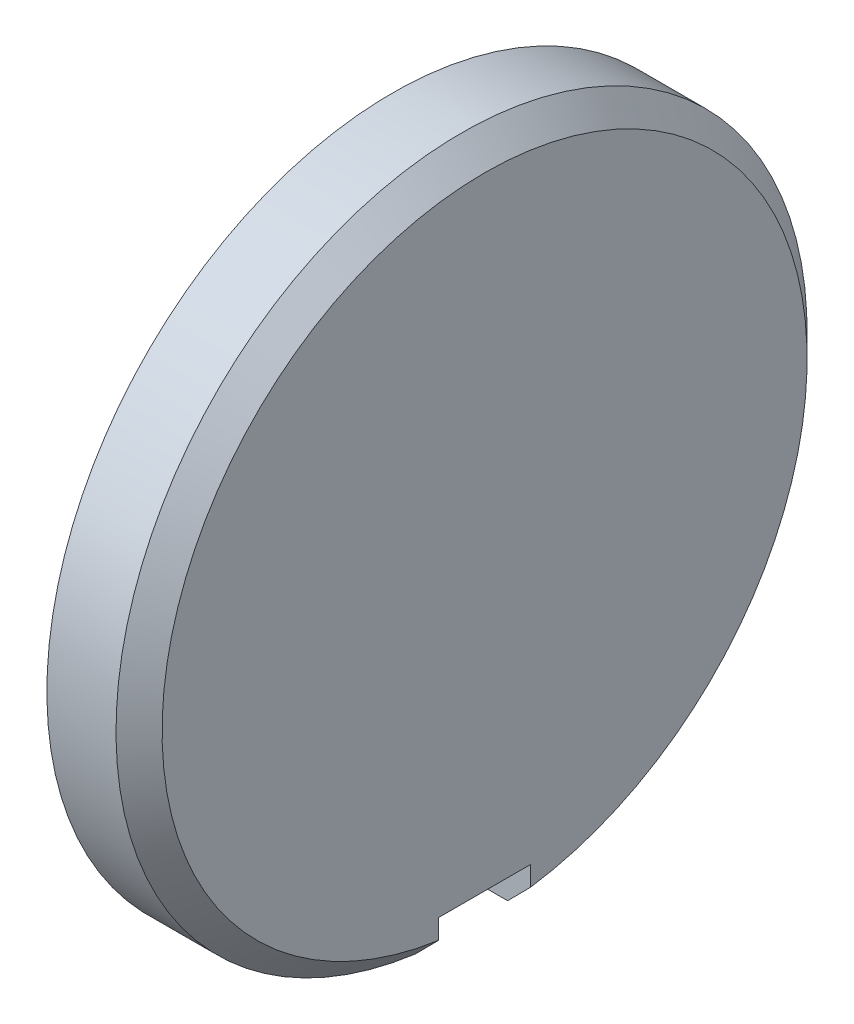
ISO-10303-21;
HEADER;
FILE_DESCRIPTION(('STEP AP214'),'2;1');
FILE_NAME('part.step','',(''),(''),'','','');
FILE_SCHEMA(('AUTOMOTIVE_DESIGN { 1 0 10303 214 1 1 1 1 }'));
ENDSEC;
DATA;
#1=APPLICATION_CONTEXT('core data for automotive mechanical design processes');
#2=APPLICATION_PROTOCOL_DEFINITION('international standard','automotive_design',2000,#1);
#3=PRODUCT_CONTEXT('',#1,'mechanical');
#4=PRODUCT('Part','Part','',(#3));
#5=PRODUCT_RELATED_PRODUCT_CATEGORY('part','',(#4));
#6=PRODUCT_DEFINITION_FORMATION('','',#4);
#7=PRODUCT_DEFINITION_CONTEXT('part definition',#1,'design');
#8=PRODUCT_DEFINITION('design','',#6,#7);
#9=PRODUCT_DEFINITION_SHAPE('','',#8);
#10=(LENGTH_UNIT() NAMED_UNIT(*) SI_UNIT(.MILLI.,.METRE.));
#11=(NAMED_UNIT(*) PLANE_ANGLE_UNIT() SI_UNIT($,.RADIAN.));
#12=(NAMED_UNIT(*) SI_UNIT($,.STERADIAN.) SOLID_ANGLE_UNIT());
#13=UNCERTAINTY_MEASURE_WITH_UNIT(LENGTH_MEASURE(1.E-05),#10,'distance_accuracy_value','');
#14=(GEOMETRIC_REPRESENTATION_CONTEXT(3) GLOBAL_UNCERTAINTY_ASSIGNED_CONTEXT((#13)) GLOBAL_UNIT_ASSIGNED_CONTEXT((#10,
#11,#12)) REPRESENTATION_CONTEXT('',''));
#15=CARTESIAN_POINT('',(0.,0.,0.));
#16=DIRECTION('',(0.,0.,1.));
#17=DIRECTION('',(1.,0.,0.));
#18=AXIS2_PLACEMENT_3D('',#15,#16,#17);
#19=CARTESIAN_POINT('',(76.8,-20.,-52.));
#20=DIRECTION('',(-1.,0.,0.));
#21=DIRECTION('',(0.,0.,1.));
#22=AXIS2_PLACEMENT_3D('',#19,#20,#21);
#23=PLANE('',#22);
#24=DIRECTION('',(0.,-1.,0.));
#25=VECTOR('',#24,1.);
#26=CARTESIAN_POINT('',(76.8,-20.,-51.2));
#27=LINE('',#26,#25);
#28=CARTESIAN_POINT('',(76.8,-25.2,-51.2));
#29=VERTEX_POINT('',#28);
#30=CARTESIAN_POINT('',(76.8,-25.5425625842204,-51.2));
#31=VERTEX_POINT('',#30);
#32=EDGE_CURVE('E210',#29,#31,#27,.T.);
#33=ORIENTED_EDGE('',*,*,#32,.F.);
#34=DIRECTION('',(0.,0.,1.));
#35=VECTOR('',#34,1.);
#36=CARTESIAN_POINT('',(76.8,-25.2,-52.));
#37=LINE('',#36,#35);
#38=CARTESIAN_POINT('',(76.8,-25.2,-52.8));
#39=VERTEX_POINT('',#38);
#40=EDGE_CURVE('E202',#39,#29,#37,.T.);
#41=ORIENTED_EDGE('',*,*,#40,.F.);
#42=DIRECTION('',(0.,-1.,0.));
#43=VECTOR('',#42,1.);
#44=CARTESIAN_POINT('',(76.8,-20.,-52.8));
#45=LINE('',#44,#43);
#46=CARTESIAN_POINT('',(76.8,-25.5425625842204,-52.8));
#47=VERTEX_POINT('',#46);
#48=EDGE_CURVE('E188',#39,#47,#45,.T.);
#49=ORIENTED_EDGE('',*,*,#48,.T.);
#50=CARTESIAN_POINT('',(76.8,-20.,-52.));
#51=DIRECTION('',(-1.,0.,0.));
#52=DIRECTION('',(0.,0.,1.));
#53=AXIS2_PLACEMENT_3D('',#50,#51,#52);
#54=CIRCLE('',#53,5.6);
#55=EDGE_CURVE('E315',#31,#47,#54,.T.);
#56=ORIENTED_EDGE('',*,*,#55,.F.);
#57=EDGE_LOOP('',(#33,#41,#49,#56));
#58=FACE_BOUND('',#57,.T.);
#59=ADVANCED_FACE('F47',(#58),#23,.F.);
#60=CARTESIAN_POINT('',(76.8,-20.,-52.));
#61=DIRECTION('',(-1.,0.,0.));
#62=DIRECTION('',(0.,0.,1.));
#63=AXIS2_PLACEMENT_3D('',#60,#61,#62);
#64=CONICAL_SURFACE('',#63,5.6,0.78539816339747);
#65=CARTESIAN_POINT('',(77.6946271909999,-24.6368667515551,-51.2));
#66=CARTESIAN_POINT('',(77.5126166868986,-24.8215553370668,-51.2));
#67=CARTESIAN_POINT('',(77.3304582431577,-25.0060979425621,-51.2));
#68=CARTESIAN_POINT('',(76.9659108831408,-25.374955064313,-51.2));
#69=CARTESIAN_POINT('',(76.7835219670777,-25.5592695807787,-51.2));
#70=CARTESIAN_POINT('',(76.418578818597,-25.9277346494659,-51.2));
#71=CARTESIAN_POINT('',(76.2360245862569,-26.1118852017641,-51.2));
#72=CARTESIAN_POINT('',(75.8707866928955,-26.480058250433,-51.2));
#73=CARTESIAN_POINT('',(75.6881030317566,-26.6640807466869,-51.2));
#74=CARTESIAN_POINT('',(75.5053728090001,-26.8480569582091,-51.2));
#75=B_SPLINE_CURVE_WITH_KNOTS('',3,(#65,#66,#67,#68,#69,#70,#71,#72,#73,#74),.UNSPECIFIED.,.F.,
.F.,(4,2,2,2,4),(0.,0.777906711944239,1.55581270618924,2.33371833583195,3.11162467374078),.UNSPECIFIED.);
#76=CARTESIAN_POINT('',(76.4,-25.9464274989274,-51.2));
#77=VERTEX_POINT('',#76);
#78=EDGE_CURVE('E217',#31,#77,#75,.T.);
#79=ORIENTED_EDGE('',*,*,#78,.F.);
#80=ORIENTED_EDGE('',*,*,#55,.T.);
#81=CARTESIAN_POINT('',(77.6946271909999,-24.6368667515551,-52.8));
#82=CARTESIAN_POINT('',(77.5126166868986,-24.8215553370668,-52.8));
#83=CARTESIAN_POINT('',(77.3304582431577,-25.0060979425621,-52.8));
#84=CARTESIAN_POINT('',(76.9659108831408,-25.374955064313,-52.8));
#85=CARTESIAN_POINT('',(76.7835219670777,-25.5592695807787,-52.8));
#86=CARTESIAN_POINT('',(76.418578818597,-25.9277346494659,-52.8));
#87=CARTESIAN_POINT('',(76.2360245862569,-26.1118852017641,-52.8));
#88=CARTESIAN_POINT('',(75.8707866928955,-26.480058250433,-52.8));
#89=CARTESIAN_POINT('',(75.6881030317566,-26.6640807466869,-52.8));
#90=CARTESIAN_POINT('',(75.5053728090001,-26.8480569582091,-52.8));
#91=B_SPLINE_CURVE_WITH_KNOTS('',3,(#81,#82,#83,#84,#85,#86,#87,#88,#89,#90),.UNSPECIFIED.,.F.,
.F.,(4,2,2,2,4),(0.,0.777906711944237,1.55581270618923,2.33371833583195,3.11162467374078),.UNSPECIFIED.);
#92=CARTESIAN_POINT('',(76.4,-25.9464274989274,-52.8));
#93=VERTEX_POINT('',#92);
#94=EDGE_CURVE('E191',#47,#93,#91,.T.);
#95=ORIENTED_EDGE('',*,*,#94,.T.);
#96=CARTESIAN_POINT('',(76.4,-20.,-52.));
#97=DIRECTION('',(-1.,0.,0.));
#98=DIRECTION('',(0.,0.,1.));
#99=AXIS2_PLACEMENT_3D('',#96,#97,#98);
#100=CIRCLE('',#99,6.);
#101=EDGE_CURVE('E311',#77,#93,#100,.T.);
#102=ORIENTED_EDGE('',*,*,#101,.F.);
#103=EDGE_LOOP('',(#79,#80,#95,#102));
#104=FACE_BOUND('',#103,.T.);
#105=ADVANCED_FACE('F470',(#104),#64,.T.);
#106=CARTESIAN_POINT('',(69.,-20.,-52.));
#107=DIRECTION('',(-1.,0.,0.));
#108=DIRECTION('',(0.,0.,1.));
#109=AXIS2_PLACEMENT_3D('',#106,#107,#108);
#110=CYLINDRICAL_SURFACE('',#109,6.);
#111=DIRECTION('',(-1.,0.,0.));
#112=VECTOR('',#111,1.);
#113=CARTESIAN_POINT('',(69.,-25.9464274989274,-51.2));
#114=LINE('',#113,#112);
#115=CARTESIAN_POINT('',(75.2,-25.9464274989274,-51.2));
#116=VERTEX_POINT('',#115);
#117=EDGE_CURVE('E197',#77,#116,#114,.T.);
#118=ORIENTED_EDGE('',*,*,#117,.F.);
#119=ORIENTED_EDGE('',*,*,#101,.T.);
#120=DIRECTION('',(-1.,0.,0.));
#121=VECTOR('',#120,1.);
#122=CARTESIAN_POINT('',(69.,-25.9464274989274,-52.8));
#123=LINE('',#122,#121);
#124=CARTESIAN_POINT('',(75.2,-25.9464274989274,-52.8));
#125=VERTEX_POINT('',#124);
#126=EDGE_CURVE('E679',#93,#125,#123,.T.);
#127=ORIENTED_EDGE('',*,*,#126,.T.);
#128=CARTESIAN_POINT('',(75.2,-20.,-52.));
#129=DIRECTION('',(-1.,0.,0.));
#130=DIRECTION('',(0.,0.,1.));
#131=AXIS2_PLACEMENT_3D('',#128,#129,#130);
#132=CIRCLE('',#131,6.);
#133=EDGE_CURVE('E307',#116,#125,#132,.T.);
#134=ORIENTED_EDGE('',*,*,#133,.F.);
#135=EDGE_LOOP('',(#118,#119,#127,#134));
#136=FACE_BOUND('',#135,.T.);
#137=ADVANCED_FACE('F475',(#136),#110,.T.);
#138=CARTESIAN_POINT('',(75.2,-14.,-52.));
#139=DIRECTION('',(1.,0.,0.));
#140=DIRECTION('',(0.,0.,-1.));
#141=AXIS2_PLACEMENT_3D('',#138,#139,#140);
#142=PLANE('',#141);
#143=CARTESIAN_POINT('',(75.2,-20.,-52.));
#144=DIRECTION('',(-1.,0.,0.));
#145=DIRECTION('',(0.,0.,1.));
#146=AXIS2_PLACEMENT_3D('',#143,#144,#145);
#147=CIRCLE('',#146,3.);
#148=CARTESIAN_POINT('',(75.2,-20.,-49.));
#149=VERTEX_POINT('',#148);
#150=EDGE_CURVE('E301',#149,#149,#147,.T.);
#151=ORIENTED_EDGE('',*,*,#150,.F.);
#152=EDGE_LOOP('',(#151));
#153=FACE_BOUND('',#152,.T.);
#154=DIRECTION('',(0.,1.,0.));
#155=VECTOR('',#154,1.);
#156=CARTESIAN_POINT('',(75.2,-14.,-51.2));
#157=LINE('',#156,#155);
#158=CARTESIAN_POINT('',(75.2,-25.2,-51.2));
#159=VERTEX_POINT('',#158);
#160=EDGE_CURVE('E11',#116,#159,#157,.T.);
#161=ORIENTED_EDGE('',*,*,#160,.F.);
#162=ORIENTED_EDGE('',*,*,#133,.T.);
#163=DIRECTION('',(0.,1.,0.));
#164=VECTOR('',#163,1.);
#165=CARTESIAN_POINT('',(75.2,-14.,-52.8));
#166=LINE('',#165,#164);
#167=CARTESIAN_POINT('',(75.2,-25.2,-52.8));
#168=VERTEX_POINT('',#167);
#169=EDGE_CURVE('E363',#125,#168,#166,.T.);
#170=ORIENTED_EDGE('',*,*,#169,.T.);
#171=DIRECTION('',(0.,0.,-1.));
#172=VECTOR('',#171,1.);
#173=CARTESIAN_POINT('',(75.2,-25.2,-52.));
#174=LINE('',#173,#172);
#175=EDGE_CURVE('E56',#159,#168,#174,.T.);
#176=ORIENTED_EDGE('',*,*,#175,.F.);
#177=EDGE_LOOP('',(#161,#162,#170,#176));
#178=FACE_BOUND('',#177,.T.);
#179=ADVANCED_FACE('F498',(#153,#178),#142,.F.);
#180=CARTESIAN_POINT('',(74.,-17.,-52.));
#181=DIRECTION('',(1.,0.,0.));
#182=DIRECTION('',(0.,0.,-1.));
#183=AXIS2_PLACEMENT_3D('',#180,#181,#182);
#184=PLANE('',#183);
#185=DIRECTION('',(0.,1.,0.));
#186=VECTOR('',#185,1.);
#187=CARTESIAN_POINT('',(74.,-17.,-51.6));
#188=LINE('',#187,#186);
#189=CARTESIAN_POINT('',(74.,-22.9732137494637,-51.6));
#190=VERTEX_POINT('',#189);
#191=CARTESIAN_POINT('',(74.,-22.2649503305812,-51.6));
#192=VERTEX_POINT('',#191);
#193=EDGE_CURVE('E248',#190,#192,#188,.T.);
#194=ORIENTED_EDGE('',*,*,#193,.F.);
#195=CARTESIAN_POINT('',(74.,-20.,-52.));
#196=DIRECTION('',(-1.,0.,0.));
#197=DIRECTION('',(0.,0.,1.));
#198=AXIS2_PLACEMENT_3D('',#195,#196,#197);
#199=CIRCLE('',#198,3.);
#200=CARTESIAN_POINT('',(74.,-20.4,-49.0267862505363));
#201=VERTEX_POINT('',#200);
#202=EDGE_CURVE('E296',#190,#201,#199,.T.);
#203=ORIENTED_EDGE('',*,*,#202,.T.);
#204=DIRECTION('',(0.,0.,1.));
#205=VECTOR('',#204,1.);
#206=CARTESIAN_POINT('',(74.,-20.4,-52.));
#207=LINE('',#206,#205);
#208=CARTESIAN_POINT('',(74.,-20.4,-49.7350496694188));
#209=VERTEX_POINT('',#208);
#210=EDGE_CURVE('E284',#209,#201,#207,.T.);
#211=ORIENTED_EDGE('',*,*,#210,.F.);
#212=CARTESIAN_POINT('',(74.,-20.,-52.));
#213=DIRECTION('',(-1.,0.,0.));
#214=DIRECTION('',(0.,0.,1.));
#215=AXIS2_PLACEMENT_3D('',#212,#213,#214);
#216=CIRCLE('',#215,2.3);
#217=EDGE_CURVE('E322',#192,#209,#216,.T.);
#218=ORIENTED_EDGE('',*,*,#217,.F.);
#219=EDGE_LOOP('',(#194,#203,#211,#218));
#220=FACE_BOUND('',#219,.T.);
#221=ADVANCED_FACE('F418',(#220),#184,.F.);
#222=DIRECTION('',(0.,1.,0.));
#223=VECTOR('',#222,1.);
#224=CARTESIAN_POINT('',(74.,-17.,-51.6));
#225=LINE('',#224,#223);
#226=CARTESIAN_POINT('',(74.,-17.7350496694188,-51.6));
#227=VERTEX_POINT('',#226);
#228=CARTESIAN_POINT('',(74.,-17.0267862505363,-51.6));
#229=VERTEX_POINT('',#228);
#230=EDGE_CURVE('E242',#227,#229,#225,.T.);
#231=ORIENTED_EDGE('',*,*,#230,.F.);
#232=CARTESIAN_POINT('',(74.,-19.6,-49.7350496694188));
#233=VERTEX_POINT('',#232);
#234=EDGE_CURVE('E323',#233,#227,#216,.T.);
#235=ORIENTED_EDGE('',*,*,#234,.F.);
#236=DIRECTION('',(0.,0.,-1.));
#237=VECTOR('',#236,1.);
#238=CARTESIAN_POINT('',(74.,-19.6,-52.));
#239=LINE('',#238,#237);
#240=CARTESIAN_POINT('',(74.,-19.6,-49.0267862505363));
#241=VERTEX_POINT('',#240);
#242=EDGE_CURVE('E273',#241,#233,#239,.T.);
#243=ORIENTED_EDGE('',*,*,#242,.F.);
#244=EDGE_CURVE('E297',#241,#229,#199,.T.);
#245=ORIENTED_EDGE('',*,*,#244,.T.);
#246=EDGE_LOOP('',(#231,#235,#243,#245));
#247=FACE_BOUND('',#246,.T.);
#248=ADVANCED_FACE('F436',(#247),#184,.F.);
#249=CARTESIAN_POINT('',(69.,-20.,-52.));
#250=DIRECTION('',(-1.,0.,0.));
#251=DIRECTION('',(0.,0.,1.));
#252=AXIS2_PLACEMENT_3D('',#249,#250,#251);
#253=CYLINDRICAL_SURFACE('',#252,2.3);
#254=CARTESIAN_POINT('',(75.2,-20.,-52.));
#255=DIRECTION('',(-1.,0.,0.));
#256=DIRECTION('',(0.,0.,1.));
#257=AXIS2_PLACEMENT_3D('',#254,#255,#256);
#258=CIRCLE('',#257,2.3);
#259=CARTESIAN_POINT('',(75.2,-20.,-49.7));
#260=VERTEX_POINT('',#259);
#261=EDGE_CURVE('E318',#260,#260,#258,.T.);
#262=ORIENTED_EDGE('',*,*,#261,.F.);
#263=EDGE_LOOP('',(#262));
#264=FACE_BOUND('',#263,.T.);
#265=DIRECTION('',(-1.,0.,0.));
#266=VECTOR('',#265,1.);
#267=CARTESIAN_POINT('',(69.,-22.2649503305812,-51.6));
#268=LINE('',#267,#266);
#269=CARTESIAN_POINT('',(75.18,-22.2649503305812,-51.6));
#270=VERTEX_POINT('',#269);
#271=EDGE_CURVE('E251',#192,#270,#268,.F.);
#272=ORIENTED_EDGE('',*,*,#271,.F.);
#273=ORIENTED_EDGE('',*,*,#217,.T.);
#274=DIRECTION('',(-1.,0.,0.));
#275=VECTOR('',#274,1.);
#276=CARTESIAN_POINT('',(69.,-20.4,-49.7350496694188));
#277=LINE('',#276,#275);
#278=CARTESIAN_POINT('',(75.18,-20.4,-49.7350496694188));
#279=VERTEX_POINT('',#278);
#280=EDGE_CURVE('E288',#279,#209,#277,.T.);
#281=ORIENTED_EDGE('',*,*,#280,.F.);
#282=CARTESIAN_POINT('',(75.18,-20.,-52.));
#283=DIRECTION('',(-1.,0.,0.));
#284=DIRECTION('',(0.,0.,1.));
#285=AXIS2_PLACEMENT_3D('',#282,#283,#284);
#286=CIRCLE('',#285,2.3);
#287=CARTESIAN_POINT('',(75.18,-19.6,-49.7350496694188));
#288=VERTEX_POINT('',#287);
#289=EDGE_CURVE('E280',#288,#279,#286,.F.);
#290=ORIENTED_EDGE('',*,*,#289,.F.);
#291=DIRECTION('',(-1.,0.,0.));
#292=VECTOR('',#291,1.);
#293=CARTESIAN_POINT('',(69.,-19.6,-49.7350496694188));
#294=LINE('',#293,#292);
#295=EDGE_CURVE('E277',#233,#288,#294,.F.);
#296=ORIENTED_EDGE('',*,*,#295,.F.);
#297=ORIENTED_EDGE('',*,*,#234,.T.);
#298=DIRECTION('',(-1.,0.,0.));
#299=VECTOR('',#298,1.);
#300=CARTESIAN_POINT('',(69.,-17.7350496694188,-51.6));
#301=LINE('',#300,#299);
#302=CARTESIAN_POINT('',(75.18,-17.7350496694188,-51.6));
#303=VERTEX_POINT('',#302);
#304=EDGE_CURVE('E245',#303,#227,#301,.T.);
#305=ORIENTED_EDGE('',*,*,#304,.F.);
#306=CARTESIAN_POINT('',(75.18,-20.,-52.));
#307=DIRECTION('',(-1.,0.,0.));
#308=DIRECTION('',(0.,0.,1.));
#309=AXIS2_PLACEMENT_3D('',#306,#307,#308);
#310=CIRCLE('',#309,2.3);
#311=CARTESIAN_POINT('',(75.18,-17.7350496694188,-52.4));
#312=VERTEX_POINT('',#311);
#313=EDGE_CURVE('E254',#312,#303,#310,.F.);
#314=ORIENTED_EDGE('',*,*,#313,.F.);
#315=DIRECTION('',(-1.,0.,0.));
#316=VECTOR('',#315,1.);
#317=CARTESIAN_POINT('',(69.,-17.7350496694188,-52.4));
#318=LINE('',#317,#316);
#319=CARTESIAN_POINT('',(74.,-17.7350496694188,-52.4));
#320=VERTEX_POINT('',#319);
#321=EDGE_CURVE('E230',#312,#320,#318,.T.);
#322=ORIENTED_EDGE('',*,*,#321,.T.);
#323=CARTESIAN_POINT('',(74.,-19.6,-54.2649503305812));
#324=VERTEX_POINT('',#323);
#325=EDGE_CURVE('E328',#320,#324,#216,.T.);
#326=ORIENTED_EDGE('',*,*,#325,.T.);
#327=DIRECTION('',(-1.,0.,0.));
#328=VECTOR('',#327,1.);
#329=CARTESIAN_POINT('',(69.,-19.6,-54.2649503305812));
#330=LINE('',#329,#328);
#331=CARTESIAN_POINT('',(75.18,-19.6,-54.2649503305812));
#332=VERTEX_POINT('',#331);
#333=EDGE_CURVE('E272',#332,#324,#330,.T.);
#334=ORIENTED_EDGE('',*,*,#333,.F.);
#335=CARTESIAN_POINT('',(75.18,-20.4,-54.2649503305812));
#336=VERTEX_POINT('',#335);
#337=EDGE_CURVE('E283',#336,#332,#286,.F.);
#338=ORIENTED_EDGE('',*,*,#337,.F.);
#339=DIRECTION('',(-1.,0.,0.));
#340=VECTOR('',#339,1.);
#341=CARTESIAN_POINT('',(69.,-20.4,-54.2649503305812));
#342=LINE('',#341,#340);
#343=CARTESIAN_POINT('',(74.,-20.4,-54.2649503305812));
#344=VERTEX_POINT('',#343);
#345=EDGE_CURVE('E293',#344,#336,#342,.F.);
#346=ORIENTED_EDGE('',*,*,#345,.F.);
#347=CARTESIAN_POINT('',(74.,-22.2649503305812,-52.4));
#348=VERTEX_POINT('',#347);
#349=EDGE_CURVE('E329',#344,#348,#216,.T.);
#350=ORIENTED_EDGE('',*,*,#349,.T.);
#351=DIRECTION('',(-1.,0.,0.));
#352=VECTOR('',#351,1.);
#353=CARTESIAN_POINT('',(69.,-22.2649503305812,-52.4));
#354=LINE('',#353,#352);
#355=CARTESIAN_POINT('',(75.18,-22.2649503305812,-52.4));
#356=VERTEX_POINT('',#355);
#357=EDGE_CURVE('E238',#348,#356,#354,.F.);
#358=ORIENTED_EDGE('',*,*,#357,.T.);
#359=EDGE_CURVE('E257',#270,#356,#310,.F.);
#360=ORIENTED_EDGE('',*,*,#359,.F.);
#361=EDGE_LOOP('',(#272,#273,#281,#290,#296,#297,#305,#314,#322,#326,#334,#338,#346,#350,#358,#360));
#362=FACE_BOUND('',#361,.T.);
#363=ADVANCED_FACE('F397',(#264,#362),#253,.F.);
#364=CARTESIAN_POINT('',(69.,-20.,-52.));
#365=DIRECTION('',(-1.,0.,0.));
#366=DIRECTION('',(0.,0.,1.));
#367=AXIS2_PLACEMENT_3D('',#364,#365,#366);
#368=CYLINDRICAL_SURFACE('',#367,3.);
#369=ORIENTED_EDGE('',*,*,#150,.T.);
#370=EDGE_LOOP('',(#369));
#371=FACE_BOUND('',#370,.T.);
#372=DIRECTION('',(-1.,0.,0.));
#373=VECTOR('',#372,1.);
#374=CARTESIAN_POINT('',(69.,-22.9732137494637,-51.6));
#375=LINE('',#374,#373);
#376=CARTESIAN_POINT('',(75.18,-22.9732137494637,-51.6));
#377=VERTEX_POINT('',#376);
#378=EDGE_CURVE('E360',#377,#190,#375,.T.);
#379=ORIENTED_EDGE('',*,*,#378,.F.);
#380=CARTESIAN_POINT('',(75.18,-20.,-52.));
#381=DIRECTION('',(-1.,0.,0.));
#382=DIRECTION('',(0.,0.,1.));
#383=AXIS2_PLACEMENT_3D('',#380,#381,#382);
#384=CIRCLE('',#383,3.);
#385=CARTESIAN_POINT('',(75.18,-22.9732137494637,-52.4));
#386=VERTEX_POINT('',#385);
#387=EDGE_CURVE('E353',#386,#377,#384,.T.);
#388=ORIENTED_EDGE('',*,*,#387,.F.);
#389=DIRECTION('',(-1.,0.,0.));
#390=VECTOR('',#389,1.);
#391=CARTESIAN_POINT('',(69.,-22.9732137494637,-52.4));
#392=LINE('',#391,#390);
#393=CARTESIAN_POINT('',(74.,-22.9732137494637,-52.4));
#394=VERTEX_POINT('',#393);
#395=EDGE_CURVE('E356',#386,#394,#392,.T.);
#396=ORIENTED_EDGE('',*,*,#395,.T.);
#397=CARTESIAN_POINT('',(74.,-20.4,-54.9732137494637));
#398=VERTEX_POINT('',#397);
#399=EDGE_CURVE('E303',#398,#394,#199,.T.);
#400=ORIENTED_EDGE('',*,*,#399,.F.);
#401=DIRECTION('',(-1.,0.,0.));
#402=VECTOR('',#401,1.);
#403=CARTESIAN_POINT('',(69.,-20.4,-54.9732137494637));
#404=LINE('',#403,#402);
#405=CARTESIAN_POINT('',(75.18,-20.4,-54.9732137494637));
#406=VERTEX_POINT('',#405);
#407=EDGE_CURVE('E335',#406,#398,#404,.T.);
#408=ORIENTED_EDGE('',*,*,#407,.F.);
#409=CARTESIAN_POINT('',(75.18,-20.,-52.));
#410=DIRECTION('',(-1.,0.,0.));
#411=DIRECTION('',(0.,0.,1.));
#412=AXIS2_PLACEMENT_3D('',#409,#410,#411);
#413=CIRCLE('',#412,3.);
#414=CARTESIAN_POINT('',(75.18,-19.6,-54.9732137494637));
#415=VERTEX_POINT('',#414);
#416=EDGE_CURVE('E332',#415,#406,#413,.T.);
#417=ORIENTED_EDGE('',*,*,#416,.F.);
#418=DIRECTION('',(-1.,0.,0.));
#419=VECTOR('',#418,1.);
#420=CARTESIAN_POINT('',(69.,-19.6,-54.9732137494637));
#421=LINE('',#420,#419);
#422=CARTESIAN_POINT('',(74.,-19.6,-54.9732137494637));
#423=VERTEX_POINT('',#422);
#424=EDGE_CURVE('E327',#423,#415,#421,.F.);
#425=ORIENTED_EDGE('',*,*,#424,.F.);
#426=CARTESIAN_POINT('',(74.,-17.0267862505363,-52.4));
#427=VERTEX_POINT('',#426);
#428=EDGE_CURVE('E302',#427,#423,#199,.T.);
#429=ORIENTED_EDGE('',*,*,#428,.F.);
#430=DIRECTION('',(-1.,0.,0.));
#431=VECTOR('',#430,1.);
#432=CARTESIAN_POINT('',(69.,-17.0267862505363,-52.4));
#433=LINE('',#432,#431);
#434=CARTESIAN_POINT('',(75.18,-17.0267862505363,-52.4));
#435=VERTEX_POINT('',#434);
#436=EDGE_CURVE('E345',#427,#435,#433,.F.);
#437=ORIENTED_EDGE('',*,*,#436,.T.);
#438=CARTESIAN_POINT('',(75.18,-17.0267862505363,-51.6));
#439=VERTEX_POINT('',#438);
#440=EDGE_CURVE('E349',#439,#435,#384,.T.);
#441=ORIENTED_EDGE('',*,*,#440,.F.);
#442=DIRECTION('',(-1.,0.,0.));
#443=VECTOR('',#442,1.);
#444=CARTESIAN_POINT('',(69.,-17.0267862505363,-51.6));
#445=LINE('',#444,#443);
#446=EDGE_CURVE('E352',#229,#439,#445,.F.);
#447=ORIENTED_EDGE('',*,*,#446,.F.);
#448=ORIENTED_EDGE('',*,*,#244,.F.);
#449=DIRECTION('',(-1.,0.,0.));
#450=VECTOR('',#449,1.);
#451=CARTESIAN_POINT('',(69.,-19.6,-49.0267862505363));
#452=LINE('',#451,#450);
#453=CARTESIAN_POINT('',(75.18,-19.6,-49.0267862505363));
#454=VERTEX_POINT('',#453);
#455=EDGE_CURVE('E339',#454,#241,#452,.T.);
#456=ORIENTED_EDGE('',*,*,#455,.F.);
#457=CARTESIAN_POINT('',(75.18,-20.4,-49.0267862505363));
#458=VERTEX_POINT('',#457);
#459=EDGE_CURVE('E336',#458,#454,#413,.T.);
#460=ORIENTED_EDGE('',*,*,#459,.F.);
#461=DIRECTION('',(-1.,0.,0.));
#462=VECTOR('',#461,1.);
#463=CARTESIAN_POINT('',(69.,-20.4,-49.0267862505363));
#464=LINE('',#463,#462);
#465=EDGE_CURVE('E342',#201,#458,#464,.F.);
#466=ORIENTED_EDGE('',*,*,#465,.F.);
#467=ORIENTED_EDGE('',*,*,#202,.F.);
#468=EDGE_LOOP('',(#379,#388,#396,#400,#408,#417,#425,#429,#437,#441,#447,#448,#456,#460,#466,#467));
#469=FACE_BOUND('',#468,.T.);
#470=ADVANCED_FACE('F406',(#371,#469),#368,.T.);
#471=ORIENTED_EDGE('',*,*,#399,.T.);
#472=DIRECTION('',(0.,1.,0.));
#473=VECTOR('',#472,1.);
#474=CARTESIAN_POINT('',(74.,-17.,-52.4));
#475=LINE('',#474,#473);
#476=EDGE_CURVE('E234',#394,#348,#475,.T.);
#477=ORIENTED_EDGE('',*,*,#476,.T.);
#478=ORIENTED_EDGE('',*,*,#349,.F.);
#479=EDGE_CURVE('E289',#398,#344,#207,.T.);
#480=ORIENTED_EDGE('',*,*,#479,.F.);
#481=EDGE_LOOP('',(#471,#477,#478,#480));
#482=FACE_BOUND('',#481,.T.);
#483=ADVANCED_FACE('F49',(#482),#184,.F.);
#484=ORIENTED_EDGE('',*,*,#325,.F.);
#485=DIRECTION('',(0.,1.,0.));
#486=VECTOR('',#485,1.);
#487=CARTESIAN_POINT('',(74.,-17.,-52.4));
#488=LINE('',#487,#486);
#489=EDGE_CURVE('E226',#320,#427,#488,.T.);
#490=ORIENTED_EDGE('',*,*,#489,.T.);
#491=ORIENTED_EDGE('',*,*,#428,.T.);
#492=EDGE_CURVE('E268',#324,#423,#239,.T.);
#493=ORIENTED_EDGE('',*,*,#492,.F.);
#494=EDGE_LOOP('',(#484,#490,#491,#493));
#495=FACE_BOUND('',#494,.T.);
#496=ADVANCED_FACE('F450',(#495),#184,.F.);
#497=CARTESIAN_POINT('',(75.2,-17.7,-52.));
#498=DIRECTION('',(1.,0.,0.));
#499=DIRECTION('',(0.,0.,-1.));
#500=AXIS2_PLACEMENT_3D('',#497,#498,#499);
#501=PLANE('',#500);
#502=ORIENTED_EDGE('',*,*,#261,.T.);
#503=EDGE_LOOP('',(#502));
#504=FACE_BOUND('',#503,.T.);
#505=ADVANCED_FACE('F481',(#504),#501,.F.);
#506=CARTESIAN_POINT('',(73.9,-19.6,-48.8));
#507=DIRECTION('',(0.,-1.,0.));
#508=DIRECTION('',(0.,0.,-1.));
#509=AXIS2_PLACEMENT_3D('',#506,#507,#508);
#510=PLANE('',#509);
#511=ORIENTED_EDGE('',*,*,#333,.T.);
#512=ORIENTED_EDGE('',*,*,#492,.T.);
#513=ORIENTED_EDGE('',*,*,#424,.T.);
#514=DIRECTION('',(0.,0.,-1.));
#515=VECTOR('',#514,1.);
#516=CARTESIAN_POINT('',(75.18,-19.6,-48.8));
#517=LINE('',#516,#515);
#518=EDGE_CURVE('E258',#332,#415,#517,.T.);
#519=ORIENTED_EDGE('',*,*,#518,.F.);
#520=EDGE_LOOP('',(#511,#512,#513,#519));
#521=FACE_BOUND('',#520,.T.);
#522=ADVANCED_FACE('F453',(#521),#510,.T.);
#523=CARTESIAN_POINT('',(75.18,-20.4,-48.8));
#524=DIRECTION('',(-1.,0.,0.));
#525=DIRECTION('',(0.,0.,1.));
#526=AXIS2_PLACEMENT_3D('',#523,#524,#525);
#527=PLANE('',#526);
#528=ORIENTED_EDGE('',*,*,#337,.T.);
#529=ORIENTED_EDGE('',*,*,#518,.T.);
#530=ORIENTED_EDGE('',*,*,#416,.T.);
#531=DIRECTION('',(0.,0.,-1.));
#532=VECTOR('',#531,1.);
#533=CARTESIAN_POINT('',(75.18,-20.4,-48.8));
#534=LINE('',#533,#532);
#535=EDGE_CURVE('E263',#336,#406,#534,.T.);
#536=ORIENTED_EDGE('',*,*,#535,.F.);
#537=EDGE_LOOP('',(#528,#529,#530,#536));
#538=FACE_BOUND('',#537,.T.);
#539=ADVANCED_FACE('F458',(#538),#527,.T.);
#540=CARTESIAN_POINT('',(73.9,-20.4,-48.8));
#541=DIRECTION('',(0.,1.,0.));
#542=DIRECTION('',(0.,0.,1.));
#543=AXIS2_PLACEMENT_3D('',#540,#541,#542);
#544=PLANE('',#543);
#545=ORIENTED_EDGE('',*,*,#345,.T.);
#546=ORIENTED_EDGE('',*,*,#535,.T.);
#547=ORIENTED_EDGE('',*,*,#407,.T.);
#548=ORIENTED_EDGE('',*,*,#479,.T.);
#549=EDGE_LOOP('',(#545,#546,#547,#548));
#550=FACE_BOUND('',#549,.T.);
#551=ADVANCED_FACE('F460',(#550),#544,.T.);
#552=ORIENTED_EDGE('',*,*,#280,.T.);
#553=ORIENTED_EDGE('',*,*,#210,.T.);
#554=ORIENTED_EDGE('',*,*,#465,.T.);
#555=EDGE_CURVE('E267',#458,#279,#534,.T.);
#556=ORIENTED_EDGE('',*,*,#555,.T.);
#557=EDGE_LOOP('',(#552,#553,#554,#556));
#558=FACE_BOUND('',#557,.T.);
#559=ADVANCED_FACE('F421',(#558),#544,.T.);
#560=ORIENTED_EDGE('',*,*,#289,.T.);
#561=ORIENTED_EDGE('',*,*,#555,.F.);
#562=ORIENTED_EDGE('',*,*,#459,.T.);
#563=EDGE_CURVE('E262',#454,#288,#517,.T.);
#564=ORIENTED_EDGE('',*,*,#563,.T.);
#565=EDGE_LOOP('',(#560,#561,#562,#564));
#566=FACE_BOUND('',#565,.T.);
#567=ADVANCED_FACE('F427',(#566),#527,.T.);
#568=ORIENTED_EDGE('',*,*,#295,.T.);
#569=ORIENTED_EDGE('',*,*,#563,.F.);
#570=ORIENTED_EDGE('',*,*,#455,.T.);
#571=ORIENTED_EDGE('',*,*,#242,.T.);
#572=EDGE_LOOP('',(#568,#569,#570,#571));
#573=FACE_BOUND('',#572,.T.);
#574=ADVANCED_FACE('F539',(#573),#510,.T.);
#575=CARTESIAN_POINT('',(0.,0.,-51.6));
#576=DIRECTION('',(0.,0.,-1.));
#577=DIRECTION('',(-1.,0.,0.));
#578=AXIS2_PLACEMENT_3D('',#575,#576,#577);
#579=PLANE('',#578);
#580=ORIENTED_EDGE('',*,*,#304,.T.);
#581=ORIENTED_EDGE('',*,*,#230,.T.);
#582=ORIENTED_EDGE('',*,*,#446,.T.);
#583=DIRECTION('',(0.,1.,0.));
#584=VECTOR('',#583,1.);
#585=CARTESIAN_POINT('',(75.18,-23.2,-51.6));
#586=LINE('',#585,#584);
#587=EDGE_CURVE('E221',#303,#439,#586,.T.);
#588=ORIENTED_EDGE('',*,*,#587,.F.);
#589=EDGE_LOOP('',(#580,#581,#582,#588));
#590=FACE_BOUND('',#589,.T.);
#591=ADVANCED_FACE('F439',(#590),#579,.T.);
#592=CARTESIAN_POINT('',(0.,0.,-52.4));
#593=DIRECTION('',(0.,0.,-1.));
#594=DIRECTION('',(-1.,0.,0.));
#595=AXIS2_PLACEMENT_3D('',#592,#593,#594);
#596=PLANE('',#595);
#597=DIRECTION('',(0.,1.,0.));
#598=VECTOR('',#597,1.);
#599=CARTESIAN_POINT('',(75.18,-23.2,-52.4));
#600=LINE('',#599,#598);
#601=EDGE_CURVE('E71',#312,#435,#600,.T.);
#602=ORIENTED_EDGE('',*,*,#601,.T.);
#603=ORIENTED_EDGE('',*,*,#436,.F.);
#604=ORIENTED_EDGE('',*,*,#489,.F.);
#605=ORIENTED_EDGE('',*,*,#321,.F.);
#606=EDGE_LOOP('',(#602,#603,#604,#605));
#607=FACE_BOUND('',#606,.T.);
#608=ADVANCED_FACE('F564',(#607),#596,.F.);
#609=CARTESIAN_POINT('',(75.18,-23.2,-51.6));
#610=DIRECTION('',(-1.,0.,0.));
#611=DIRECTION('',(0.,0.,1.));
#612=AXIS2_PLACEMENT_3D('',#609,#610,#611);
#613=PLANE('',#612);
#614=ORIENTED_EDGE('',*,*,#313,.T.);
#615=ORIENTED_EDGE('',*,*,#587,.T.);
#616=ORIENTED_EDGE('',*,*,#440,.T.);
#617=ORIENTED_EDGE('',*,*,#601,.F.);
#618=EDGE_LOOP('',(#614,#615,#616,#617));
#619=FACE_BOUND('',#618,.T.);
#620=ADVANCED_FACE('F444',(#619),#613,.T.);
#621=ORIENTED_EDGE('',*,*,#359,.T.);
#622=EDGE_CURVE('E215',#386,#356,#600,.T.);
#623=ORIENTED_EDGE('',*,*,#622,.F.);
#624=ORIENTED_EDGE('',*,*,#387,.T.);
#625=EDGE_CURVE('E224',#377,#270,#586,.T.);
#626=ORIENTED_EDGE('',*,*,#625,.T.);
#627=EDGE_LOOP('',(#621,#623,#624,#626));
#628=FACE_BOUND('',#627,.T.);
#629=ADVANCED_FACE('F410',(#628),#613,.T.);
#630=ORIENTED_EDGE('',*,*,#271,.T.);
#631=ORIENTED_EDGE('',*,*,#625,.F.);
#632=ORIENTED_EDGE('',*,*,#378,.T.);
#633=ORIENTED_EDGE('',*,*,#193,.T.);
#634=EDGE_LOOP('',(#630,#631,#632,#633));
#635=FACE_BOUND('',#634,.T.);
#636=ADVANCED_FACE('F412',(#635),#579,.T.);
#637=ORIENTED_EDGE('',*,*,#476,.F.);
#638=ORIENTED_EDGE('',*,*,#395,.F.);
#639=ORIENTED_EDGE('',*,*,#622,.T.);
#640=ORIENTED_EDGE('',*,*,#357,.F.);
#641=EDGE_LOOP('',(#637,#638,#639,#640));
#642=FACE_BOUND('',#641,.T.);
#643=ADVANCED_FACE('F391',(#642),#596,.F.);
#644=CARTESIAN_POINT('',(75.1,-25.2,-51.2));
#645=DIRECTION('',(0.,-1.,0.));
#646=DIRECTION('',(0.,0.,-1.));
#647=AXIS2_PLACEMENT_3D('',#644,#645,#646);
#648=PLANE('',#647);
#649=ORIENTED_EDGE('',*,*,#40,.T.);
#650=DIRECTION('',(-1.,0.,0.));
#651=VECTOR('',#650,1.);
#652=CARTESIAN_POINT('',(75.1,-25.2,-51.2));
#653=LINE('',#652,#651);
#654=EDGE_CURVE('E207',#29,#159,#653,.T.);
#655=ORIENTED_EDGE('',*,*,#654,.T.);
#656=ORIENTED_EDGE('',*,*,#175,.T.);
#657=DIRECTION('',(-1.,0.,0.));
#658=VECTOR('',#657,1.);
#659=CARTESIAN_POINT('',(75.1,-25.2,-52.8));
#660=LINE('',#659,#658);
#661=EDGE_CURVE('E63',#39,#168,#660,.T.);
#662=ORIENTED_EDGE('',*,*,#661,.F.);
#663=EDGE_LOOP('',(#649,#655,#656,#662));
#664=FACE_BOUND('',#663,.T.);
#665=ADVANCED_FACE('F200',(#664),#648,.T.);
#666=CARTESIAN_POINT('',(0.,0.,-51.2));
#667=DIRECTION('',(0.,0.,-1.));
#668=DIRECTION('',(-1.,0.,0.));
#669=AXIS2_PLACEMENT_3D('',#666,#667,#668);
#670=PLANE('',#669);
#671=ORIENTED_EDGE('',*,*,#32,.T.);
#672=ORIENTED_EDGE('',*,*,#78,.T.);
#673=ORIENTED_EDGE('',*,*,#117,.T.);
#674=ORIENTED_EDGE('',*,*,#160,.T.);
#675=ORIENTED_EDGE('',*,*,#654,.F.);
#676=EDGE_LOOP('',(#671,#672,#673,#674,#675));
#677=FACE_BOUND('',#676,.T.);
#678=ADVANCED_FACE('F648',(#677),#670,.T.);
#679=CARTESIAN_POINT('',(0.,0.,-52.8));
#680=DIRECTION('',(0.,0.,-1.));
#681=DIRECTION('',(-1.,0.,0.));
#682=AXIS2_PLACEMENT_3D('',#679,#680,#681);
#683=PLANE('',#682);
#684=ORIENTED_EDGE('',*,*,#661,.T.);
#685=ORIENTED_EDGE('',*,*,#169,.F.);
#686=ORIENTED_EDGE('',*,*,#126,.F.);
#687=ORIENTED_EDGE('',*,*,#94,.F.);
#688=ORIENTED_EDGE('',*,*,#48,.F.);
#689=EDGE_LOOP('',(#684,#685,#686,#687,#688));
#690=FACE_BOUND('',#689,.T.);
#691=ADVANCED_FACE('F189',(#690),#683,.F.);
#692=CLOSED_SHELL('',(#59,#105,#137,#179,#221,#248,#363,#470,#483,#496,#505,#522,#539,#551,#559,
#567,#574,#591,#608,#620,#629,#636,#643,#665,#678,#691));
#693=MANIFOLD_SOLID_BREP('B2',#692);
#694=ADVANCED_BREP_SHAPE_REPRESENTATION('',(#18,#693),#14);
#695=SHAPE_DEFINITION_REPRESENTATION(#9,#694);
ENDSEC;
END-ISO-10303-21;
